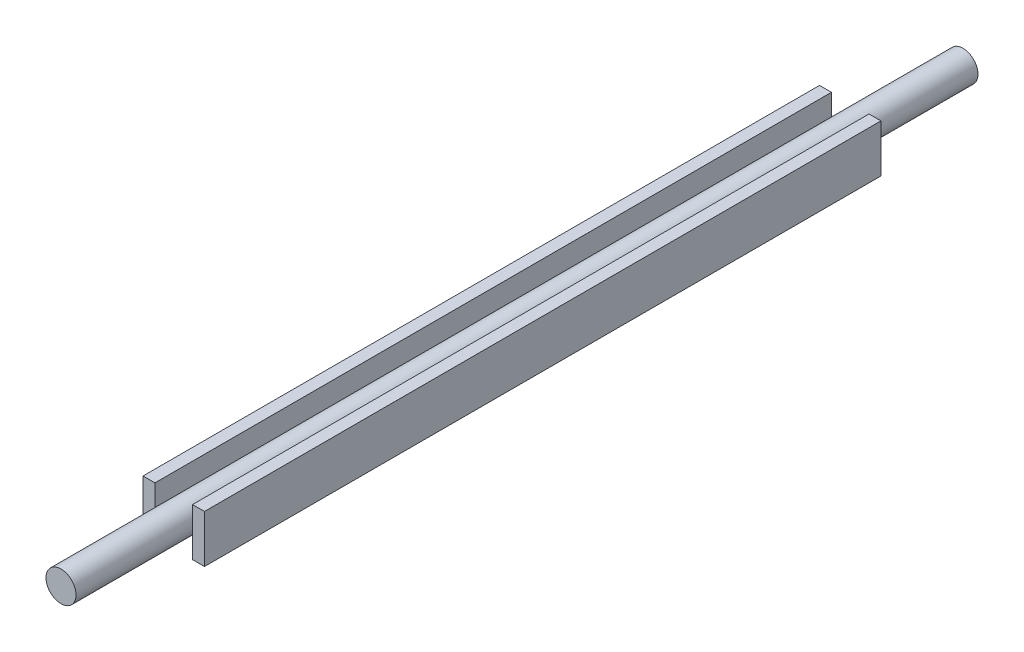
ISO-10303-21;
HEADER;
FILE_DESCRIPTION(('STEP AP214'),'2;1');
FILE_NAME('part.step','',(''),(''),'','','');
FILE_SCHEMA(('AUTOMOTIVE_DESIGN { 1 0 10303 214 1 1 1 1 }'));
ENDSEC;
DATA;
#1=APPLICATION_CONTEXT('core data for automotive mechanical design processes');
#2=APPLICATION_PROTOCOL_DEFINITION('international standard','automotive_design',2000,#1);
#3=PRODUCT_CONTEXT('',#1,'mechanical');
#4=PRODUCT('Part','Part','',(#3));
#5=PRODUCT_RELATED_PRODUCT_CATEGORY('part','',(#4));
#6=PRODUCT_DEFINITION_FORMATION('','',#4);
#7=PRODUCT_DEFINITION_CONTEXT('part definition',#1,'design');
#8=PRODUCT_DEFINITION('design','',#6,#7);
#9=PRODUCT_DEFINITION_SHAPE('','',#8);
#10=(LENGTH_UNIT() NAMED_UNIT(*) SI_UNIT(.MILLI.,.METRE.));
#11=(NAMED_UNIT(*) PLANE_ANGLE_UNIT() SI_UNIT($,.RADIAN.));
#12=(NAMED_UNIT(*) SI_UNIT($,.STERADIAN.) SOLID_ANGLE_UNIT());
#13=UNCERTAINTY_MEASURE_WITH_UNIT(LENGTH_MEASURE(1.E-05),#10,'distance_accuracy_value','');
#14=(GEOMETRIC_REPRESENTATION_CONTEXT(3) GLOBAL_UNCERTAINTY_ASSIGNED_CONTEXT((#13)) GLOBAL_UNIT_ASSIGNED_CONTEXT((#10,
#11,#12)) REPRESENTATION_CONTEXT('',''));
#15=CARTESIAN_POINT('',(0.,0.,0.));
#16=DIRECTION('',(0.,0.,1.));
#17=DIRECTION('',(1.,0.,0.));
#18=AXIS2_PLACEMENT_3D('',#15,#16,#17);
#19=CARTESIAN_POINT('',(0.,0.,120.));
#20=DIRECTION('',(0.,0.,-1.));
#21=DIRECTION('',(-1.,0.,0.));
#22=AXIS2_PLACEMENT_3D('',#19,#20,#21);
#23=CYLINDRICAL_SURFACE('',#22,4.);
#24=CARTESIAN_POINT('',(0.,0.,120.));
#25=DIRECTION('',(0.,0.,1.));
#26=DIRECTION('',(1.,0.,0.));
#27=AXIS2_PLACEMENT_3D('',#24,#25,#26);
#28=CIRCLE('',#27,4.);
#29=CARTESIAN_POINT('',(4.,0.,120.));
#30=VERTEX_POINT('',#29);
#31=EDGE_CURVE('E11',#30,#30,#28,.T.);
#32=ORIENTED_EDGE('',*,*,#31,.F.);
#33=EDGE_LOOP('',(#32));
#34=FACE_BOUND('',#33,.T.);
#35=CARTESIAN_POINT('',(0.,0.,-120.));
#36=DIRECTION('',(0.,0.,1.));
#37=DIRECTION('',(1.,0.,0.));
#38=AXIS2_PLACEMENT_3D('',#35,#36,#37);
#39=CIRCLE('',#38,4.);
#40=CARTESIAN_POINT('',(4.,0.,-120.));
#41=VERTEX_POINT('',#40);
#42=EDGE_CURVE('E51',#41,#41,#39,.T.);
#43=ORIENTED_EDGE('',*,*,#42,.T.);
#44=EDGE_LOOP('',(#43));
#45=FACE_BOUND('',#44,.T.);
#46=ADVANCED_FACE('F48',(#34,#45),#23,.T.);
#47=CARTESIAN_POINT('',(0.,0.,120.));
#48=DIRECTION('',(0.,0.,1.));
#49=DIRECTION('',(1.,0.,0.));
#50=AXIS2_PLACEMENT_3D('',#47,#48,#49);
#51=PLANE('',#50);
#52=ORIENTED_EDGE('',*,*,#31,.T.);
#53=EDGE_LOOP('',(#52));
#54=FACE_BOUND('',#53,.T.);
#55=ADVANCED_FACE('F63',(#54),#51,.T.);
#56=CARTESIAN_POINT('',(0.,0.,-120.));
#57=DIRECTION('',(0.,0.,1.));
#58=DIRECTION('',(1.,0.,0.));
#59=AXIS2_PLACEMENT_3D('',#56,#57,#58);
#60=PLANE('',#59);
#61=ORIENTED_EDGE('',*,*,#42,.F.);
#62=EDGE_LOOP('',(#61));
#63=FACE_BOUND('',#62,.T.);
#64=ADVANCED_FACE('F61',(#63),#60,.F.);
#65=CLOSED_SHELL('',(#46,#55,#64));
#66=MANIFOLD_SOLID_BREP('B2',#65);
#67=CARTESIAN_POINT('',(-5.,0.,90.));
#68=DIRECTION('',(1.,0.,0.));
#69=DIRECTION('',(0.,1.,0.));
#70=AXIS2_PLACEMENT_3D('',#67,#68,#69);
#71=PLANE('',#70);
#72=DIRECTION('',(0.,-1.,0.));
#73=VECTOR('',#72,1.);
#74=CARTESIAN_POINT('',(-5.,0.,-90.));
#75=LINE('',#74,#73);
#76=CARTESIAN_POINT('',(-5.,6.35,-90.));
#77=VERTEX_POINT('',#76);
#78=CARTESIAN_POINT('',(-5.,-6.35,-90.));
#79=VERTEX_POINT('',#78);
#80=EDGE_CURVE('E161',#77,#79,#75,.T.);
#81=ORIENTED_EDGE('',*,*,#80,.F.);
#82=DIRECTION('',(0.,0.,-1.));
#83=VECTOR('',#82,1.);
#84=CARTESIAN_POINT('',(-5.,6.35,90.));
#85=LINE('',#84,#83);
#86=CARTESIAN_POINT('',(-5.,6.35,90.));
#87=VERTEX_POINT('',#86);
#88=EDGE_CURVE('E46',#87,#77,#85,.T.);
#89=ORIENTED_EDGE('',*,*,#88,.F.);
#90=DIRECTION('',(0.,-1.,0.));
#91=VECTOR('',#90,1.);
#92=CARTESIAN_POINT('',(-5.,0.,90.));
#93=LINE('',#92,#91);
#94=CARTESIAN_POINT('',(-5.,-6.35,90.));
#95=VERTEX_POINT('',#94);
#96=EDGE_CURVE('E155',#87,#95,#93,.T.);
#97=ORIENTED_EDGE('',*,*,#96,.T.);
#98=DIRECTION('',(0.,0.,-1.));
#99=VECTOR('',#98,1.);
#100=CARTESIAN_POINT('',(-5.,-6.35,90.));
#101=LINE('',#100,#99);
#102=EDGE_CURVE('E136',#95,#79,#101,.T.);
#103=ORIENTED_EDGE('',*,*,#102,.T.);
#104=EDGE_LOOP('',(#81,#89,#97,#103));
#105=FACE_BOUND('',#104,.T.);
#106=ADVANCED_FACE('F98',(#105),#71,.T.);
#107=CARTESIAN_POINT('',(0.,6.35,90.));
#108=DIRECTION('',(0.,1.,0.));
#109=DIRECTION('',(0.,0.,1.));
#110=AXIS2_PLACEMENT_3D('',#107,#108,#109);
#111=PLANE('',#110);
#112=DIRECTION('',(1.,0.,0.));
#113=VECTOR('',#112,1.);
#114=CARTESIAN_POINT('',(0.,6.35,-90.));
#115=LINE('',#114,#113);
#116=CARTESIAN_POINT('',(-8.175,6.35,-90.));
#117=VERTEX_POINT('',#116);
#118=EDGE_CURVE('E149',#117,#77,#115,.T.);
#119=ORIENTED_EDGE('',*,*,#118,.F.);
#120=DIRECTION('',(0.,0.,-1.));
#121=VECTOR('',#120,1.);
#122=CARTESIAN_POINT('',(-8.175,6.35,90.));
#123=LINE('',#122,#121);
#124=CARTESIAN_POINT('',(-8.175,6.35,90.));
#125=VERTEX_POINT('',#124);
#126=EDGE_CURVE('E106',#125,#117,#123,.T.);
#127=ORIENTED_EDGE('',*,*,#126,.F.);
#128=DIRECTION('',(1.,0.,0.));
#129=VECTOR('',#128,1.);
#130=CARTESIAN_POINT('',(0.,6.35,90.));
#131=LINE('',#130,#129);
#132=EDGE_CURVE('E147',#125,#87,#131,.T.);
#133=ORIENTED_EDGE('',*,*,#132,.T.);
#134=ORIENTED_EDGE('',*,*,#88,.T.);
#135=EDGE_LOOP('',(#119,#127,#133,#134));
#136=FACE_BOUND('',#135,.T.);
#137=ADVANCED_FACE('F145',(#136),#111,.T.);
#138=CARTESIAN_POINT('',(-8.175,0.,90.));
#139=DIRECTION('',(1.,0.,0.));
#140=DIRECTION('',(0.,1.,0.));
#141=AXIS2_PLACEMENT_3D('',#138,#139,#140);
#142=PLANE('',#141);
#143=DIRECTION('',(0.,-1.,0.));
#144=VECTOR('',#143,1.);
#145=CARTESIAN_POINT('',(-8.175,0.,-90.));
#146=LINE('',#145,#144);
#147=CARTESIAN_POINT('',(-8.175,-6.35,-90.));
#148=VERTEX_POINT('',#147);
#149=EDGE_CURVE('E129',#117,#148,#146,.T.);
#150=ORIENTED_EDGE('',*,*,#149,.T.);
#151=DIRECTION('',(0.,0.,-1.));
#152=VECTOR('',#151,1.);
#153=CARTESIAN_POINT('',(-8.175,-6.35,90.));
#154=LINE('',#153,#152);
#155=CARTESIAN_POINT('',(-8.175,-6.35,90.));
#156=VERTEX_POINT('',#155);
#157=EDGE_CURVE('E150',#156,#148,#154,.T.);
#158=ORIENTED_EDGE('',*,*,#157,.F.);
#159=DIRECTION('',(0.,-1.,0.));
#160=VECTOR('',#159,1.);
#161=CARTESIAN_POINT('',(-8.175,0.,90.));
#162=LINE('',#161,#160);
#163=EDGE_CURVE('E151',#125,#156,#162,.T.);
#164=ORIENTED_EDGE('',*,*,#163,.F.);
#165=ORIENTED_EDGE('',*,*,#126,.T.);
#166=EDGE_LOOP('',(#150,#158,#164,#165));
#167=FACE_BOUND('',#166,.T.);
#168=ADVANCED_FACE('F152',(#167),#142,.F.);
#169=CARTESIAN_POINT('',(0.,-6.35,90.));
#170=DIRECTION('',(0.,1.,0.));
#171=DIRECTION('',(0.,0.,1.));
#172=AXIS2_PLACEMENT_3D('',#169,#170,#171);
#173=PLANE('',#172);
#174=DIRECTION('',(1.,0.,0.));
#175=VECTOR('',#174,1.);
#176=CARTESIAN_POINT('',(0.,-6.35,-90.));
#177=LINE('',#176,#175);
#178=EDGE_CURVE('E157',#148,#79,#177,.T.);
#179=ORIENTED_EDGE('',*,*,#178,.T.);
#180=ORIENTED_EDGE('',*,*,#102,.F.);
#181=DIRECTION('',(1.,0.,0.));
#182=VECTOR('',#181,1.);
#183=CARTESIAN_POINT('',(0.,-6.35,90.));
#184=LINE('',#183,#182);
#185=EDGE_CURVE('E114',#156,#95,#184,.T.);
#186=ORIENTED_EDGE('',*,*,#185,.F.);
#187=ORIENTED_EDGE('',*,*,#157,.T.);
#188=EDGE_LOOP('',(#179,#180,#186,#187));
#189=FACE_BOUND('',#188,.T.);
#190=ADVANCED_FACE('F170',(#189),#173,.F.);
#191=CARTESIAN_POINT('',(0.,0.,90.));
#192=DIRECTION('',(0.,0.,1.));
#193=DIRECTION('',(1.,0.,0.));
#194=AXIS2_PLACEMENT_3D('',#191,#192,#193);
#195=PLANE('',#194);
#196=ORIENTED_EDGE('',*,*,#96,.F.);
#197=ORIENTED_EDGE('',*,*,#132,.F.);
#198=ORIENTED_EDGE('',*,*,#163,.T.);
#199=ORIENTED_EDGE('',*,*,#185,.T.);
#200=EDGE_LOOP('',(#196,#197,#198,#199));
#201=FACE_BOUND('',#200,.T.);
#202=ADVANCED_FACE('F154',(#201),#195,.T.);
#203=CARTESIAN_POINT('',(0.,0.,-90.));
#204=DIRECTION('',(0.,0.,1.));
#205=DIRECTION('',(1.,0.,0.));
#206=AXIS2_PLACEMENT_3D('',#203,#204,#205);
#207=PLANE('',#206);
#208=ORIENTED_EDGE('',*,*,#80,.T.);
#209=ORIENTED_EDGE('',*,*,#178,.F.);
#210=ORIENTED_EDGE('',*,*,#149,.F.);
#211=ORIENTED_EDGE('',*,*,#118,.T.);
#212=EDGE_LOOP('',(#208,#209,#210,#211));
#213=FACE_BOUND('',#212,.T.);
#214=ADVANCED_FACE('F172',(#213),#207,.F.);
#215=CLOSED_SHELL('',(#106,#137,#168,#190,#202,#214));
#216=MANIFOLD_SOLID_BREP('B6',#215);
#217=CARTESIAN_POINT('',(8.175,0.,90.));
#218=DIRECTION('',(1.,0.,0.));
#219=DIRECTION('',(0.,1.,0.));
#220=AXIS2_PLACEMENT_3D('',#217,#218,#219);
#221=PLANE('',#220);
#222=DIRECTION('',(0.,-1.,0.));
#223=VECTOR('',#222,1.);
#224=CARTESIAN_POINT('',(8.175,0.,-90.));
#225=LINE('',#224,#223);
#226=CARTESIAN_POINT('',(8.175,6.35,-90.));
#227=VERTEX_POINT('',#226);
#228=CARTESIAN_POINT('',(8.175,-6.35,-90.));
#229=VERTEX_POINT('',#228);
#230=EDGE_CURVE('E285',#227,#229,#225,.T.);
#231=ORIENTED_EDGE('',*,*,#230,.F.);
#232=DIRECTION('',(0.,0.,-1.));
#233=VECTOR('',#232,1.);
#234=CARTESIAN_POINT('',(8.175,6.35,90.));
#235=LINE('',#234,#233);
#236=CARTESIAN_POINT('',(8.175,6.35,90.));
#237=VERTEX_POINT('',#236);
#238=EDGE_CURVE('E96',#237,#227,#235,.T.);
#239=ORIENTED_EDGE('',*,*,#238,.F.);
#240=DIRECTION('',(0.,-1.,0.));
#241=VECTOR('',#240,1.);
#242=CARTESIAN_POINT('',(8.175,0.,90.));
#243=LINE('',#242,#241);
#244=CARTESIAN_POINT('',(8.175,-6.35,90.));
#245=VERTEX_POINT('',#244);
#246=EDGE_CURVE('E270',#237,#245,#243,.T.);
#247=ORIENTED_EDGE('',*,*,#246,.T.);
#248=DIRECTION('',(0.,0.,-1.));
#249=VECTOR('',#248,1.);
#250=CARTESIAN_POINT('',(8.175,-6.35,90.));
#251=LINE('',#250,#249);
#252=EDGE_CURVE('E238',#245,#229,#251,.T.);
#253=ORIENTED_EDGE('',*,*,#252,.T.);
#254=EDGE_LOOP('',(#231,#239,#247,#253));
#255=FACE_BOUND('',#254,.T.);
#256=ADVANCED_FACE('F222',(#255),#221,.T.);
#257=CARTESIAN_POINT('',(0.,6.35,90.));
#258=DIRECTION('',(0.,-1.,0.));
#259=DIRECTION('',(0.,0.,-1.));
#260=AXIS2_PLACEMENT_3D('',#257,#258,#259);
#261=PLANE('',#260);
#262=DIRECTION('',(-1.,0.,0.));
#263=VECTOR('',#262,1.);
#264=CARTESIAN_POINT('',(0.,6.35,-90.));
#265=LINE('',#264,#263);
#266=CARTESIAN_POINT('',(5.,6.35,-90.));
#267=VERTEX_POINT('',#266);
#268=EDGE_CURVE('E276',#227,#267,#265,.T.);
#269=ORIENTED_EDGE('',*,*,#268,.T.);
#270=DIRECTION('',(0.,0.,-1.));
#271=VECTOR('',#270,1.);
#272=CARTESIAN_POINT('',(5.,6.35,90.));
#273=LINE('',#272,#271);
#274=CARTESIAN_POINT('',(5.,6.35,90.));
#275=VERTEX_POINT('',#274);
#276=EDGE_CURVE('E230',#275,#267,#273,.T.);
#277=ORIENTED_EDGE('',*,*,#276,.F.);
#278=DIRECTION('',(-1.,0.,0.));
#279=VECTOR('',#278,1.);
#280=CARTESIAN_POINT('',(0.,6.35,90.));
#281=LINE('',#280,#279);
#282=EDGE_CURVE('E264',#237,#275,#281,.T.);
#283=ORIENTED_EDGE('',*,*,#282,.F.);
#284=ORIENTED_EDGE('',*,*,#238,.T.);
#285=EDGE_LOOP('',(#269,#277,#283,#284));
#286=FACE_BOUND('',#285,.T.);
#287=ADVANCED_FACE('F274',(#286),#261,.F.);
#288=CARTESIAN_POINT('',(5.,0.,90.));
#289=DIRECTION('',(1.,0.,0.));
#290=DIRECTION('',(0.,1.,0.));
#291=AXIS2_PLACEMENT_3D('',#288,#289,#290);
#292=PLANE('',#291);
#293=DIRECTION('',(0.,-1.,0.));
#294=VECTOR('',#293,1.);
#295=CARTESIAN_POINT('',(5.,0.,-90.));
#296=LINE('',#295,#294);
#297=CARTESIAN_POINT('',(5.,-6.35,-90.));
#298=VERTEX_POINT('',#297);
#299=EDGE_CURVE('E288',#267,#298,#296,.T.);
#300=ORIENTED_EDGE('',*,*,#299,.T.);
#301=DIRECTION('',(0.,0.,-1.));
#302=VECTOR('',#301,1.);
#303=CARTESIAN_POINT('',(5.,-6.35,90.));
#304=LINE('',#303,#302);
#305=CARTESIAN_POINT('',(5.,-6.35,90.));
#306=VERTEX_POINT('',#305);
#307=EDGE_CURVE('E252',#306,#298,#304,.T.);
#308=ORIENTED_EDGE('',*,*,#307,.F.);
#309=DIRECTION('',(0.,-1.,0.));
#310=VECTOR('',#309,1.);
#311=CARTESIAN_POINT('',(5.,0.,90.));
#312=LINE('',#311,#310);
#313=EDGE_CURVE('E269',#275,#306,#312,.T.);
#314=ORIENTED_EDGE('',*,*,#313,.F.);
#315=ORIENTED_EDGE('',*,*,#276,.T.);
#316=EDGE_LOOP('',(#300,#308,#314,#315));
#317=FACE_BOUND('',#316,.T.);
#318=ADVANCED_FACE('F279',(#317),#292,.F.);
#319=CARTESIAN_POINT('',(0.,-6.35,90.));
#320=DIRECTION('',(0.,-1.,0.));
#321=DIRECTION('',(0.,0.,-1.));
#322=AXIS2_PLACEMENT_3D('',#319,#320,#321);
#323=PLANE('',#322);
#324=DIRECTION('',(-1.,0.,0.));
#325=VECTOR('',#324,1.);
#326=CARTESIAN_POINT('',(0.,-6.35,-90.));
#327=LINE('',#326,#325);
#328=EDGE_CURVE('E290',#229,#298,#327,.T.);
#329=ORIENTED_EDGE('',*,*,#328,.F.);
#330=ORIENTED_EDGE('',*,*,#252,.F.);
#331=DIRECTION('',(-1.,0.,0.));
#332=VECTOR('',#331,1.);
#333=CARTESIAN_POINT('',(0.,-6.35,90.));
#334=LINE('',#333,#332);
#335=EDGE_CURVE('E280',#245,#306,#334,.T.);
#336=ORIENTED_EDGE('',*,*,#335,.T.);
#337=ORIENTED_EDGE('',*,*,#307,.T.);
#338=EDGE_LOOP('',(#329,#330,#336,#337));
#339=FACE_BOUND('',#338,.T.);
#340=ADVANCED_FACE('F295',(#339),#323,.T.);
#341=CARTESIAN_POINT('',(0.,0.,90.));
#342=DIRECTION('',(0.,0.,1.));
#343=DIRECTION('',(1.,0.,0.));
#344=AXIS2_PLACEMENT_3D('',#341,#342,#343);
#345=PLANE('',#344);
#346=ORIENTED_EDGE('',*,*,#246,.F.);
#347=ORIENTED_EDGE('',*,*,#282,.T.);
#348=ORIENTED_EDGE('',*,*,#313,.T.);
#349=ORIENTED_EDGE('',*,*,#335,.F.);
#350=EDGE_LOOP('',(#346,#347,#348,#349));
#351=FACE_BOUND('',#350,.T.);
#352=ADVANCED_FACE('F266',(#351),#345,.T.);
#353=CARTESIAN_POINT('',(0.,0.,-90.));
#354=DIRECTION('',(0.,0.,1.));
#355=DIRECTION('',(1.,0.,0.));
#356=AXIS2_PLACEMENT_3D('',#353,#354,#355);
#357=PLANE('',#356);
#358=ORIENTED_EDGE('',*,*,#230,.T.);
#359=ORIENTED_EDGE('',*,*,#328,.T.);
#360=ORIENTED_EDGE('',*,*,#299,.F.);
#361=ORIENTED_EDGE('',*,*,#268,.F.);
#362=EDGE_LOOP('',(#358,#359,#360,#361));
#363=FACE_BOUND('',#362,.T.);
#364=ADVANCED_FACE('F302',(#363),#357,.F.);
#365=CLOSED_SHELL('',(#256,#287,#318,#340,#352,#364));
#366=MANIFOLD_SOLID_BREP('B40',#365);
#367=ADVANCED_BREP_SHAPE_REPRESENTATION('',(#18,#66,#216,#366),#14);
#368=SHAPE_DEFINITION_REPRESENTATION(#9,#367);
ENDSEC;
END-ISO-10303-21;
